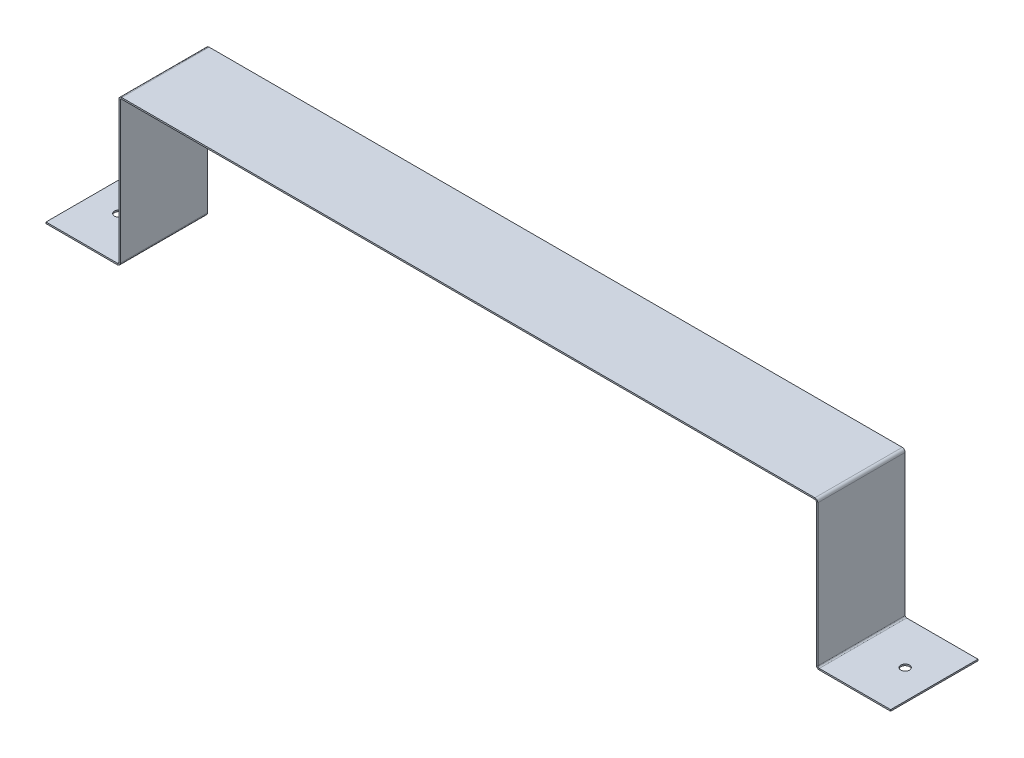
ISO-10303-21;
HEADER;
FILE_DESCRIPTION(('STEP AP214'),'2;1');
FILE_NAME('part.step','',(''),(''),'','','');
FILE_SCHEMA(('AUTOMOTIVE_DESIGN { 1 0 10303 214 1 1 1 1 }'));
ENDSEC;
DATA;
#1=APPLICATION_CONTEXT('core data for automotive mechanical design processes');
#2=APPLICATION_PROTOCOL_DEFINITION('international standard','automotive_design',2000,#1);
#3=PRODUCT_CONTEXT('',#1,'mechanical');
#4=PRODUCT('Part','Part','',(#3));
#5=PRODUCT_RELATED_PRODUCT_CATEGORY('part','',(#4));
#6=PRODUCT_DEFINITION_FORMATION('','',#4);
#7=PRODUCT_DEFINITION_CONTEXT('part definition',#1,'design');
#8=PRODUCT_DEFINITION('design','',#6,#7);
#9=PRODUCT_DEFINITION_SHAPE('','',#8);
#10=(LENGTH_UNIT() NAMED_UNIT(*) SI_UNIT(.MILLI.,.METRE.));
#11=(NAMED_UNIT(*) PLANE_ANGLE_UNIT() SI_UNIT($,.RADIAN.));
#12=(NAMED_UNIT(*) SI_UNIT($,.STERADIAN.) SOLID_ANGLE_UNIT());
#13=UNCERTAINTY_MEASURE_WITH_UNIT(LENGTH_MEASURE(1.E-05),#10,'distance_accuracy_value','');
#14=(GEOMETRIC_REPRESENTATION_CONTEXT(3) GLOBAL_UNCERTAINTY_ASSIGNED_CONTEXT((#13)) GLOBAL_UNIT_ASSIGNED_CONTEXT((#10,
#11,#12)) REPRESENTATION_CONTEXT('',''));
#15=CARTESIAN_POINT('',(0.,0.,0.));
#16=DIRECTION('',(0.,0.,1.));
#17=DIRECTION('',(1.,0.,0.));
#18=AXIS2_PLACEMENT_3D('',#15,#16,#17);
#19=CARTESIAN_POINT('',(-120.,0.5,30.));
#20=DIRECTION('',(0.,0.,1.));
#21=DIRECTION('',(1.,0.,0.));
#22=AXIS2_PLACEMENT_3D('',#19,#20,#21);
#23=PLANE('',#22);
#24=DIRECTION('',(1.,0.,0.));
#25=VECTOR('',#24,1.);
#26=CARTESIAN_POINT('',(-120.,0.5,30.));
#27=LINE('',#26,#25);
#28=CARTESIAN_POINT('',(-120.,0.5,30.));
#29=VERTEX_POINT('',#28);
#30=CARTESIAN_POINT('',(-119.5,0.5,30.));
#31=VERTEX_POINT('',#30);
#32=EDGE_CURVE('E11',#29,#31,#27,.T.);
#33=ORIENTED_EDGE('',*,*,#32,.F.);
#34=CARTESIAN_POINT('',(-120.5,0.5,30.));
#35=DIRECTION('',(0.,0.,-1.));
#36=DIRECTION('',(-1.,0.,0.));
#37=AXIS2_PLACEMENT_3D('',#34,#35,#36);
#38=CIRCLE('',#37,0.5);
#39=CARTESIAN_POINT('',(-120.5,0.,30.));
#40=VERTEX_POINT('',#39);
#41=EDGE_CURVE('E367',#40,#29,#38,.F.);
#42=ORIENTED_EDGE('',*,*,#41,.F.);
#43=DIRECTION('',(0.,1.,0.));
#44=VECTOR('',#43,1.);
#45=CARTESIAN_POINT('',(-120.5,-0.5,30.));
#46=LINE('',#45,#44);
#47=CARTESIAN_POINT('',(-120.5,-0.5,30.));
#48=VERTEX_POINT('',#47);
#49=EDGE_CURVE('E45',#48,#40,#46,.T.);
#50=ORIENTED_EDGE('',*,*,#49,.F.);
#51=CARTESIAN_POINT('',(-120.5,0.5,30.));
#52=DIRECTION('',(0.,0.,1.));
#53=DIRECTION('',(1.,0.,0.));
#54=AXIS2_PLACEMENT_3D('',#51,#52,#53);
#55=CIRCLE('',#54,1.);
#56=EDGE_CURVE('E380',#48,#31,#55,.T.);
#57=ORIENTED_EDGE('',*,*,#56,.T.);
#58=EDGE_LOOP('',(#33,#42,#50,#57));
#59=FACE_BOUND('',#58,.T.);
#60=ADVANCED_FACE('F37',(#59),#23,.T.);
#61=CARTESIAN_POINT('',(-120.5,-0.5,30.));
#62=DIRECTION('',(0.,0.,1.));
#63=DIRECTION('',(1.,0.,0.));
#64=AXIS2_PLACEMENT_3D('',#61,#62,#63);
#65=PLANE('',#64);
#66=DIRECTION('',(0.,1.,0.));
#67=VECTOR('',#66,1.);
#68=CARTESIAN_POINT('',(-120.,0.,30.));
#69=LINE('',#68,#67);
#70=CARTESIAN_POINT('',(-120.,49.,30.));
#71=VERTEX_POINT('',#70);
#72=EDGE_CURVE('E371',#29,#71,#69,.T.);
#73=ORIENTED_EDGE('',*,*,#72,.F.);
#74=ORIENTED_EDGE('',*,*,#32,.T.);
#75=DIRECTION('',(0.,1.,0.));
#76=VECTOR('',#75,1.);
#77=CARTESIAN_POINT('',(-119.5,0.,30.));
#78=LINE('',#77,#76);
#79=CARTESIAN_POINT('',(-119.5,49.,30.));
#80=VERTEX_POINT('',#79);
#81=EDGE_CURVE('E382',#31,#80,#78,.T.);
#82=ORIENTED_EDGE('',*,*,#81,.T.);
#83=DIRECTION('',(-1.,0.,0.));
#84=VECTOR('',#83,1.);
#85=CARTESIAN_POINT('',(-119.5,49.,30.));
#86=LINE('',#85,#84);
#87=EDGE_CURVE('E341',#80,#71,#86,.T.);
#88=ORIENTED_EDGE('',*,*,#87,.T.);
#89=EDGE_LOOP('',(#73,#74,#82,#88));
#90=FACE_BOUND('',#89,.T.);
#91=ADVANCED_FACE('F452',(#90),#65,.T.);
#92=CARTESIAN_POINT('',(-120.5,0.,0.));
#93=DIRECTION('',(0.,0.,-1.));
#94=DIRECTION('',(-1.,0.,0.));
#95=AXIS2_PLACEMENT_3D('',#92,#93,#94);
#96=PLANE('',#95);
#97=DIRECTION('',(0.,-1.,0.));
#98=VECTOR('',#97,1.);
#99=CARTESIAN_POINT('',(-120.5,0.,0.));
#100=LINE('',#99,#98);
#101=CARTESIAN_POINT('',(-120.5,0.,0.));
#102=VERTEX_POINT('',#101);
#103=CARTESIAN_POINT('',(-120.5,-0.5,0.));
#104=VERTEX_POINT('',#103);
#105=EDGE_CURVE('E347',#102,#104,#100,.T.);
#106=ORIENTED_EDGE('',*,*,#105,.F.);
#107=CARTESIAN_POINT('',(-120.5,0.5,0.));
#108=DIRECTION('',(0.,0.,-1.));
#109=DIRECTION('',(-1.,0.,0.));
#110=AXIS2_PLACEMENT_3D('',#107,#108,#109);
#111=CIRCLE('',#110,0.5);
#112=CARTESIAN_POINT('',(-120.,0.5,0.));
#113=VERTEX_POINT('',#112);
#114=EDGE_CURVE('E251',#102,#113,#111,.F.);
#115=ORIENTED_EDGE('',*,*,#114,.T.);
#116=DIRECTION('',(-1.,0.,0.));
#117=VECTOR('',#116,1.);
#118=CARTESIAN_POINT('',(-119.5,0.5,0.));
#119=LINE('',#118,#117);
#120=CARTESIAN_POINT('',(-119.5,0.5,0.));
#121=VERTEX_POINT('',#120);
#122=EDGE_CURVE('E345',#121,#113,#119,.T.);
#123=ORIENTED_EDGE('',*,*,#122,.F.);
#124=CARTESIAN_POINT('',(-120.5,0.5,0.));
#125=DIRECTION('',(0.,0.,1.));
#126=DIRECTION('',(1.,0.,0.));
#127=AXIS2_PLACEMENT_3D('',#124,#125,#126);
#128=CIRCLE('',#127,1.);
#129=EDGE_CURVE('E263',#104,#121,#128,.T.);
#130=ORIENTED_EDGE('',*,*,#129,.F.);
#131=EDGE_LOOP('',(#106,#115,#123,#130));
#132=FACE_BOUND('',#131,.T.);
#133=ADVANCED_FACE('F494',(#132),#96,.T.);
#134=CARTESIAN_POINT('',(-119.5,0.5,0.));
#135=DIRECTION('',(0.,0.,-1.));
#136=DIRECTION('',(-1.,0.,0.));
#137=AXIS2_PLACEMENT_3D('',#134,#135,#136);
#138=PLANE('',#137);
#139=DIRECTION('',(1.,0.,0.));
#140=VECTOR('',#139,1.);
#141=CARTESIAN_POINT('',(-145.,0.,0.));
#142=LINE('',#141,#140);
#143=CARTESIAN_POINT('',(-145.,0.,0.));
#144=VERTEX_POINT('',#143);
#145=EDGE_CURVE('E254',#144,#102,#142,.T.);
#146=ORIENTED_EDGE('',*,*,#145,.T.);
#147=ORIENTED_EDGE('',*,*,#105,.T.);
#148=DIRECTION('',(1.,0.,0.));
#149=VECTOR('',#148,1.);
#150=CARTESIAN_POINT('',(-145.,-0.5,0.));
#151=LINE('',#150,#149);
#152=CARTESIAN_POINT('',(-145.,-0.5,0.));
#153=VERTEX_POINT('',#152);
#154=EDGE_CURVE('E260',#153,#104,#151,.T.);
#155=ORIENTED_EDGE('',*,*,#154,.F.);
#156=DIRECTION('',(0.,1.,0.));
#157=VECTOR('',#156,1.);
#158=CARTESIAN_POINT('',(-145.,-0.5,0.));
#159=LINE('',#158,#157);
#160=EDGE_CURVE('E257',#153,#144,#159,.T.);
#161=ORIENTED_EDGE('',*,*,#160,.T.);
#162=EDGE_LOOP('',(#146,#147,#155,#161));
#163=FACE_BOUND('',#162,.T.);
#164=ADVANCED_FACE('F498',(#163),#138,.T.);
#165=CARTESIAN_POINT('',(-119.,50.,30.));
#166=DIRECTION('',(0.,0.,1.));
#167=DIRECTION('',(1.,0.,0.));
#168=AXIS2_PLACEMENT_3D('',#165,#166,#167);
#169=PLANE('',#168);
#170=DIRECTION('',(0.,-1.,0.));
#171=VECTOR('',#170,1.);
#172=CARTESIAN_POINT('',(-119.,50.,30.));
#173=LINE('',#172,#171);
#174=CARTESIAN_POINT('',(-119.,50.,30.));
#175=VERTEX_POINT('',#174);
#176=CARTESIAN_POINT('',(-119.,49.5,30.));
#177=VERTEX_POINT('',#176);
#178=EDGE_CURVE('E343',#175,#177,#173,.T.);
#179=ORIENTED_EDGE('',*,*,#178,.F.);
#180=CARTESIAN_POINT('',(-119.,49.,30.));
#181=DIRECTION('',(0.,0.,1.));
#182=DIRECTION('',(1.,0.,0.));
#183=AXIS2_PLACEMENT_3D('',#180,#181,#182);
#184=CIRCLE('',#183,1.);
#185=EDGE_CURVE('E442',#71,#175,#184,.F.);
#186=ORIENTED_EDGE('',*,*,#185,.F.);
#187=ORIENTED_EDGE('',*,*,#87,.F.);
#188=CARTESIAN_POINT('',(-119.,49.,30.));
#189=DIRECTION('',(0.,0.,1.));
#190=DIRECTION('',(1.,0.,0.));
#191=AXIS2_PLACEMENT_3D('',#188,#189,#190);
#192=CIRCLE('',#191,0.5);
#193=EDGE_CURVE('E385',#80,#177,#192,.F.);
#194=ORIENTED_EDGE('',*,*,#193,.T.);
#195=EDGE_LOOP('',(#179,#186,#187,#194));
#196=FACE_BOUND('',#195,.T.);
#197=ADVANCED_FACE('F459',(#196),#169,.T.);
#198=CARTESIAN_POINT('',(-119.5,49.,30.));
#199=DIRECTION('',(0.,0.,1.));
#200=DIRECTION('',(1.,0.,0.));
#201=AXIS2_PLACEMENT_3D('',#198,#199,#200);
#202=PLANE('',#201);
#203=DIRECTION('',(1.,0.,0.));
#204=VECTOR('',#203,1.);
#205=CARTESIAN_POINT('',(-120.,50.,30.));
#206=LINE('',#205,#204);
#207=CARTESIAN_POINT('',(119.,50.,30.));
#208=VERTEX_POINT('',#207);
#209=EDGE_CURVE('E439',#175,#208,#206,.T.);
#210=ORIENTED_EDGE('',*,*,#209,.F.);
#211=ORIENTED_EDGE('',*,*,#178,.T.);
#212=DIRECTION('',(1.,0.,0.));
#213=VECTOR('',#212,1.);
#214=CARTESIAN_POINT('',(-120.,49.5,30.));
#215=LINE('',#214,#213);
#216=CARTESIAN_POINT('',(119.,49.5,30.));
#217=VERTEX_POINT('',#216);
#218=EDGE_CURVE('E204',#177,#217,#215,.T.);
#219=ORIENTED_EDGE('',*,*,#218,.T.);
#220=DIRECTION('',(-1.11022302462516E-13,1.,0.));
#221=VECTOR('',#220,1.);
#222=CARTESIAN_POINT('',(119.,49.5,30.));
#223=LINE('',#222,#221);
#224=EDGE_CURVE('E195',#217,#208,#223,.T.);
#225=ORIENTED_EDGE('',*,*,#224,.T.);
#226=EDGE_LOOP('',(#210,#211,#219,#225));
#227=FACE_BOUND('',#226,.T.);
#228=ADVANCED_FACE('F391',(#227),#202,.T.);
#229=CARTESIAN_POINT('',(-120.,49.,0.));
#230=DIRECTION('',(0.,0.,-1.));
#231=DIRECTION('',(-1.,0.,0.));
#232=AXIS2_PLACEMENT_3D('',#229,#230,#231);
#233=PLANE('',#232);
#234=DIRECTION('',(1.,0.,0.));
#235=VECTOR('',#234,1.);
#236=CARTESIAN_POINT('',(-120.,49.,0.));
#237=LINE('',#236,#235);
#238=CARTESIAN_POINT('',(-120.,49.,0.));
#239=VERTEX_POINT('',#238);
#240=CARTESIAN_POINT('',(-119.5,49.,0.));
#241=VERTEX_POINT('',#240);
#242=EDGE_CURVE('E339',#239,#241,#237,.T.);
#243=ORIENTED_EDGE('',*,*,#242,.F.);
#244=CARTESIAN_POINT('',(-119.,49.,0.));
#245=DIRECTION('',(0.,0.,1.));
#246=DIRECTION('',(1.,0.,0.));
#247=AXIS2_PLACEMENT_3D('',#244,#245,#246);
#248=CIRCLE('',#247,1.);
#249=CARTESIAN_POINT('',(-119.,50.,0.));
#250=VERTEX_POINT('',#249);
#251=EDGE_CURVE('E245',#239,#250,#248,.F.);
#252=ORIENTED_EDGE('',*,*,#251,.T.);
#253=DIRECTION('',(0.,1.,0.));
#254=VECTOR('',#253,1.);
#255=CARTESIAN_POINT('',(-119.,49.5,0.));
#256=LINE('',#255,#254);
#257=CARTESIAN_POINT('',(-119.,49.5,0.));
#258=VERTEX_POINT('',#257);
#259=EDGE_CURVE('E194',#258,#250,#256,.T.);
#260=ORIENTED_EDGE('',*,*,#259,.F.);
#261=CARTESIAN_POINT('',(-119.,49.,0.));
#262=DIRECTION('',(0.,0.,1.));
#263=DIRECTION('',(1.,0.,0.));
#264=AXIS2_PLACEMENT_3D('',#261,#262,#263);
#265=CIRCLE('',#264,0.5);
#266=EDGE_CURVE('E269',#241,#258,#265,.F.);
#267=ORIENTED_EDGE('',*,*,#266,.F.);
#268=EDGE_LOOP('',(#243,#252,#260,#267));
#269=FACE_BOUND('',#268,.T.);
#270=ADVANCED_FACE('F468',(#269),#233,.T.);
#271=CARTESIAN_POINT('',(-119.,49.5,0.));
#272=DIRECTION('',(0.,0.,-1.));
#273=DIRECTION('',(-1.,0.,0.));
#274=AXIS2_PLACEMENT_3D('',#271,#272,#273);
#275=PLANE('',#274);
#276=DIRECTION('',(0.,1.,0.));
#277=VECTOR('',#276,1.);
#278=CARTESIAN_POINT('',(-120.,0.,0.));
#279=LINE('',#278,#277);
#280=EDGE_CURVE('E248',#113,#239,#279,.T.);
#281=ORIENTED_EDGE('',*,*,#280,.T.);
#282=ORIENTED_EDGE('',*,*,#242,.T.);
#283=DIRECTION('',(0.,1.,0.));
#284=VECTOR('',#283,1.);
#285=CARTESIAN_POINT('',(-119.5,0.,0.));
#286=LINE('',#285,#284);
#287=EDGE_CURVE('E266',#121,#241,#286,.T.);
#288=ORIENTED_EDGE('',*,*,#287,.F.);
#289=ORIENTED_EDGE('',*,*,#122,.T.);
#290=EDGE_LOOP('',(#281,#282,#288,#289));
#291=FACE_BOUND('',#290,.T.);
#292=ADVANCED_FACE('F472',(#291),#275,.T.);
#293=CARTESIAN_POINT('',(120.,49.,30.));
#294=DIRECTION('',(0.,0.,1.));
#295=DIRECTION('',(1.,0.,0.));
#296=AXIS2_PLACEMENT_3D('',#293,#294,#295);
#297=PLANE('',#296);
#298=DIRECTION('',(-1.,0.,0.));
#299=VECTOR('',#298,1.);
#300=CARTESIAN_POINT('',(120.,49.,30.));
#301=LINE('',#300,#299);
#302=CARTESIAN_POINT('',(120.,49.,30.));
#303=VERTEX_POINT('',#302);
#304=CARTESIAN_POINT('',(119.5,49.,30.));
#305=VERTEX_POINT('',#304);
#306=EDGE_CURVE('E182',#303,#305,#301,.T.);
#307=ORIENTED_EDGE('',*,*,#306,.F.);
#308=CARTESIAN_POINT('',(119.,49.,30.));
#309=DIRECTION('',(0.,0.,1.));
#310=DIRECTION('',(1.,0.,0.));
#311=AXIS2_PLACEMENT_3D('',#308,#309,#310);
#312=CIRCLE('',#311,1.);
#313=EDGE_CURVE('E403',#208,#303,#312,.F.);
#314=ORIENTED_EDGE('',*,*,#313,.F.);
#315=ORIENTED_EDGE('',*,*,#224,.F.);
#316=CARTESIAN_POINT('',(119.,49.,30.));
#317=DIRECTION('',(0.,0.,1.));
#318=DIRECTION('',(1.,0.,0.));
#319=AXIS2_PLACEMENT_3D('',#316,#317,#318);
#320=CIRCLE('',#319,0.5);
#321=EDGE_CURVE('E198',#217,#305,#320,.F.);
#322=ORIENTED_EDGE('',*,*,#321,.T.);
#323=EDGE_LOOP('',(#307,#314,#315,#322));
#324=FACE_BOUND('',#323,.T.);
#325=ADVANCED_FACE('F200',(#324),#297,.T.);
#326=CARTESIAN_POINT('',(119.,49.5,30.));
#327=DIRECTION('',(0.,0.,1.));
#328=DIRECTION('',(1.,0.,0.));
#329=AXIS2_PLACEMENT_3D('',#326,#327,#328);
#330=PLANE('',#329);
#331=DIRECTION('',(0.,-1.,0.));
#332=VECTOR('',#331,1.);
#333=CARTESIAN_POINT('',(120.,50.,30.));
#334=LINE('',#333,#332);
#335=CARTESIAN_POINT('',(120.,0.5,30.));
#336=VERTEX_POINT('',#335);
#337=EDGE_CURVE('E189',#303,#336,#334,.T.);
#338=ORIENTED_EDGE('',*,*,#337,.F.);
#339=ORIENTED_EDGE('',*,*,#306,.T.);
#340=DIRECTION('',(0.,1.,0.));
#341=VECTOR('',#340,1.);
#342=CARTESIAN_POINT('',(119.5,50.,30.));
#343=LINE('',#342,#341);
#344=CARTESIAN_POINT('',(119.5,0.500000000000001,30.));
#345=VERTEX_POINT('',#344);
#346=EDGE_CURVE('E186',#305,#345,#343,.F.);
#347=ORIENTED_EDGE('',*,*,#346,.T.);
#348=DIRECTION('',(1.,0.,0.));
#349=VECTOR('',#348,1.);
#350=CARTESIAN_POINT('',(119.5,0.500000000000001,30.));
#351=LINE('',#350,#349);
#352=EDGE_CURVE('E330',#345,#336,#351,.T.);
#353=ORIENTED_EDGE('',*,*,#352,.T.);
#354=EDGE_LOOP('',(#338,#339,#347,#353));
#355=FACE_BOUND('',#354,.T.);
#356=ADVANCED_FACE('F184',(#355),#330,.T.);
#357=CARTESIAN_POINT('',(119.,50.,0.));
#358=DIRECTION('',(0.,0.,-1.));
#359=DIRECTION('',(-1.,0.,0.));
#360=AXIS2_PLACEMENT_3D('',#357,#358,#359);
#361=PLANE('',#360);
#362=DIRECTION('',(1.11022302462516E-13,-1.,0.));
#363=VECTOR('',#362,1.);
#364=CARTESIAN_POINT('',(119.,50.,0.));
#365=LINE('',#364,#363);
#366=CARTESIAN_POINT('',(119.,50.,0.));
#367=VERTEX_POINT('',#366);
#368=CARTESIAN_POINT('',(119.,49.5,0.));
#369=VERTEX_POINT('',#368);
#370=EDGE_CURVE('E335',#367,#369,#365,.T.);
#371=ORIENTED_EDGE('',*,*,#370,.F.);
#372=CARTESIAN_POINT('',(119.,49.,0.));
#373=DIRECTION('',(0.,0.,1.));
#374=DIRECTION('',(1.,0.,0.));
#375=AXIS2_PLACEMENT_3D('',#372,#373,#374);
#376=CIRCLE('',#375,1.);
#377=CARTESIAN_POINT('',(120.,49.,0.));
#378=VERTEX_POINT('',#377);
#379=EDGE_CURVE('E239',#367,#378,#376,.F.);
#380=ORIENTED_EDGE('',*,*,#379,.T.);
#381=DIRECTION('',(1.,0.,0.));
#382=VECTOR('',#381,1.);
#383=CARTESIAN_POINT('',(119.5,49.,0.));
#384=LINE('',#383,#382);
#385=CARTESIAN_POINT('',(119.5,49.,0.));
#386=VERTEX_POINT('',#385);
#387=EDGE_CURVE('E333',#386,#378,#384,.T.);
#388=ORIENTED_EDGE('',*,*,#387,.F.);
#389=CARTESIAN_POINT('',(119.,49.,0.));
#390=DIRECTION('',(0.,0.,1.));
#391=DIRECTION('',(1.,0.,0.));
#392=AXIS2_PLACEMENT_3D('',#389,#390,#391);
#393=CIRCLE('',#392,0.5);
#394=EDGE_CURVE('E211',#369,#386,#393,.F.);
#395=ORIENTED_EDGE('',*,*,#394,.F.);
#396=EDGE_LOOP('',(#371,#380,#388,#395));
#397=FACE_BOUND('',#396,.T.);
#398=ADVANCED_FACE('F397',(#397),#361,.T.);
#399=CARTESIAN_POINT('',(119.5,49.,0.));
#400=DIRECTION('',(0.,0.,-1.));
#401=DIRECTION('',(-1.,0.,0.));
#402=AXIS2_PLACEMENT_3D('',#399,#400,#401);
#403=PLANE('',#402);
#404=DIRECTION('',(1.,0.,0.));
#405=VECTOR('',#404,1.);
#406=CARTESIAN_POINT('',(-120.,50.,0.));
#407=LINE('',#406,#405);
#408=EDGE_CURVE('E242',#250,#367,#407,.T.);
#409=ORIENTED_EDGE('',*,*,#408,.T.);
#410=ORIENTED_EDGE('',*,*,#370,.T.);
#411=DIRECTION('',(1.,0.,0.));
#412=VECTOR('',#411,1.);
#413=CARTESIAN_POINT('',(-120.,49.5,0.));
#414=LINE('',#413,#412);
#415=EDGE_CURVE('E272',#258,#369,#414,.T.);
#416=ORIENTED_EDGE('',*,*,#415,.F.);
#417=ORIENTED_EDGE('',*,*,#259,.T.);
#418=EDGE_LOOP('',(#409,#410,#416,#417));
#419=FACE_BOUND('',#418,.T.);
#420=ADVANCED_FACE('F478',(#419),#403,.T.);
#421=CARTESIAN_POINT('',(120.5,0.,30.));
#422=DIRECTION('',(0.,0.,1.));
#423=DIRECTION('',(1.,0.,0.));
#424=AXIS2_PLACEMENT_3D('',#421,#422,#423);
#425=PLANE('',#424);
#426=DIRECTION('',(0.,-1.,0.));
#427=VECTOR('',#426,1.);
#428=CARTESIAN_POINT('',(120.5,0.,30.));
#429=LINE('',#428,#427);
#430=CARTESIAN_POINT('',(120.5,0.,30.));
#431=VERTEX_POINT('',#430);
#432=CARTESIAN_POINT('',(120.5,-0.5,30.));
#433=VERTEX_POINT('',#432);
#434=EDGE_CURVE('E53',#431,#433,#429,.T.);
#435=ORIENTED_EDGE('',*,*,#434,.F.);
#436=CARTESIAN_POINT('',(120.5,0.5,30.));
#437=DIRECTION('',(0.,0.,-1.));
#438=DIRECTION('',(-1.,0.,0.));
#439=AXIS2_PLACEMENT_3D('',#436,#437,#438);
#440=CIRCLE('',#439,0.5);
#441=EDGE_CURVE('E431',#336,#431,#440,.F.);
#442=ORIENTED_EDGE('',*,*,#441,.F.);
#443=ORIENTED_EDGE('',*,*,#352,.F.);
#444=CARTESIAN_POINT('',(120.5,0.5,30.));
#445=DIRECTION('',(0.,0.,1.));
#446=DIRECTION('',(1.,0.,0.));
#447=AXIS2_PLACEMENT_3D('',#444,#445,#446);
#448=CIRCLE('',#447,1.);
#449=EDGE_CURVE('E219',#345,#433,#448,.T.);
#450=ORIENTED_EDGE('',*,*,#449,.T.);
#451=EDGE_LOOP('',(#435,#442,#443,#450));
#452=FACE_BOUND('',#451,.T.);
#453=ADVANCED_FACE('F480',(#452),#425,.T.);
#454=CARTESIAN_POINT('',(119.5,0.500000000000001,30.));
#455=DIRECTION('',(0.,0.,1.));
#456=DIRECTION('',(1.,0.,0.));
#457=AXIS2_PLACEMENT_3D('',#454,#455,#456);
#458=PLANE('',#457);
#459=DIRECTION('',(1.,0.,0.));
#460=VECTOR('',#459,1.);
#461=CARTESIAN_POINT('',(120.,0.,30.));
#462=LINE('',#461,#460);
#463=CARTESIAN_POINT('',(145.,0.,30.));
#464=VERTEX_POINT('',#463);
#465=EDGE_CURVE('E429',#431,#464,#462,.T.);
#466=ORIENTED_EDGE('',*,*,#465,.F.);
#467=ORIENTED_EDGE('',*,*,#434,.T.);
#468=DIRECTION('',(1.,0.,0.));
#469=VECTOR('',#468,1.);
#470=CARTESIAN_POINT('',(120.,-0.5,30.));
#471=LINE('',#470,#469);
#472=CARTESIAN_POINT('',(145.,-0.5,30.));
#473=VERTEX_POINT('',#472);
#474=EDGE_CURVE('E131',#433,#473,#471,.T.);
#475=ORIENTED_EDGE('',*,*,#474,.T.);
#476=DIRECTION('',(0.,-1.,0.));
#477=VECTOR('',#476,1.);
#478=CARTESIAN_POINT('',(145.,0.,30.));
#479=LINE('',#478,#477);
#480=EDGE_CURVE('E427',#464,#473,#479,.T.);
#481=ORIENTED_EDGE('',*,*,#480,.F.);
#482=EDGE_LOOP('',(#466,#467,#475,#481));
#483=FACE_BOUND('',#482,.T.);
#484=ADVANCED_FACE('F486',(#483),#458,.T.);
#485=CARTESIAN_POINT('',(120.,0.5,0.));
#486=DIRECTION('',(0.,0.,-1.));
#487=DIRECTION('',(-1.,0.,0.));
#488=AXIS2_PLACEMENT_3D('',#485,#486,#487);
#489=PLANE('',#488);
#490=DIRECTION('',(-1.,0.,0.));
#491=VECTOR('',#490,1.);
#492=CARTESIAN_POINT('',(120.,0.5,0.));
#493=LINE('',#492,#491);
#494=CARTESIAN_POINT('',(120.,0.5,0.));
#495=VERTEX_POINT('',#494);
#496=CARTESIAN_POINT('',(119.5,0.500000000000001,0.));
#497=VERTEX_POINT('',#496);
#498=EDGE_CURVE('E118',#495,#497,#493,.T.);
#499=ORIENTED_EDGE('',*,*,#498,.F.);
#500=CARTESIAN_POINT('',(120.5,0.5,0.));
#501=DIRECTION('',(0.,0.,-1.));
#502=DIRECTION('',(-1.,0.,0.));
#503=AXIS2_PLACEMENT_3D('',#500,#501,#502);
#504=CIRCLE('',#503,0.5);
#505=CARTESIAN_POINT('',(120.5,0.,0.));
#506=VERTEX_POINT('',#505);
#507=EDGE_CURVE('E235',#495,#506,#504,.F.);
#508=ORIENTED_EDGE('',*,*,#507,.T.);
#509=DIRECTION('',(0.,1.,0.));
#510=VECTOR('',#509,1.);
#511=CARTESIAN_POINT('',(120.5,-0.5,0.));
#512=LINE('',#511,#510);
#513=CARTESIAN_POINT('',(120.5,-0.5,0.));
#514=VERTEX_POINT('',#513);
#515=EDGE_CURVE('E125',#514,#506,#512,.T.);
#516=ORIENTED_EDGE('',*,*,#515,.F.);
#517=CARTESIAN_POINT('',(120.5,0.5,0.));
#518=DIRECTION('',(0.,0.,1.));
#519=DIRECTION('',(1.,0.,0.));
#520=AXIS2_PLACEMENT_3D('',#517,#518,#519);
#521=CIRCLE('',#520,1.);
#522=EDGE_CURVE('E278',#497,#514,#521,.T.);
#523=ORIENTED_EDGE('',*,*,#522,.F.);
#524=EDGE_LOOP('',(#499,#508,#516,#523));
#525=FACE_BOUND('',#524,.T.);
#526=ADVANCED_FACE('F414',(#525),#489,.T.);
#527=CARTESIAN_POINT('',(120.5,-0.5,0.));
#528=DIRECTION('',(0.,0.,-1.));
#529=DIRECTION('',(-1.,0.,0.));
#530=AXIS2_PLACEMENT_3D('',#527,#528,#529);
#531=PLANE('',#530);
#532=DIRECTION('',(0.,-1.,0.));
#533=VECTOR('',#532,1.);
#534=CARTESIAN_POINT('',(120.,50.,0.));
#535=LINE('',#534,#533);
#536=EDGE_CURVE('E237',#378,#495,#535,.T.);
#537=ORIENTED_EDGE('',*,*,#536,.T.);
#538=ORIENTED_EDGE('',*,*,#498,.T.);
#539=DIRECTION('',(0.,1.,0.));
#540=VECTOR('',#539,1.);
#541=CARTESIAN_POINT('',(119.5,50.,0.));
#542=LINE('',#541,#540);
#543=EDGE_CURVE('E276',#386,#497,#542,.F.);
#544=ORIENTED_EDGE('',*,*,#543,.F.);
#545=ORIENTED_EDGE('',*,*,#387,.T.);
#546=EDGE_LOOP('',(#537,#538,#544,#545));
#547=FACE_BOUND('',#546,.T.);
#548=ADVANCED_FACE('F399',(#547),#531,.T.);
#549=CARTESIAN_POINT('',(120.,-0.5,30.));
#550=DIRECTION('',(0.,1.,0.));
#551=DIRECTION('',(0.,0.,1.));
#552=AXIS2_PLACEMENT_3D('',#549,#550,#551);
#553=PLANE('',#552);
#554=CARTESIAN_POINT('',(135.,-0.5,15.));
#555=DIRECTION('',(0.,1.,0.));
#556=DIRECTION('',(0.,0.,1.));
#557=AXIS2_PLACEMENT_3D('',#554,#555,#556);
#558=CIRCLE('',#557,1.5);
#559=CARTESIAN_POINT('',(135.,-0.5,16.5));
#560=VERTEX_POINT('',#559);
#561=EDGE_CURVE('E229',#560,#560,#558,.T.);
#562=ORIENTED_EDGE('',*,*,#561,.T.);
#563=EDGE_LOOP('',(#562));
#564=FACE_BOUND('',#563,.T.);
#565=DIRECTION('',(1.,0.,0.));
#566=VECTOR('',#565,1.);
#567=CARTESIAN_POINT('',(120.,-0.5,0.));
#568=LINE('',#567,#566);
#569=CARTESIAN_POINT('',(145.,-0.5,0.));
#570=VERTEX_POINT('',#569);
#571=EDGE_CURVE('E225',#514,#570,#568,.T.);
#572=ORIENTED_EDGE('',*,*,#571,.T.);
#573=DIRECTION('',(0.,0.,-1.));
#574=VECTOR('',#573,1.);
#575=CARTESIAN_POINT('',(145.,-0.5,30.));
#576=LINE('',#575,#574);
#577=EDGE_CURVE('E326',#473,#570,#576,.T.);
#578=ORIENTED_EDGE('',*,*,#577,.F.);
#579=ORIENTED_EDGE('',*,*,#474,.F.);
#580=DIRECTION('',(0.,0.,-1.));
#581=VECTOR('',#580,1.);
#582=CARTESIAN_POINT('',(120.5,-0.5,30.));
#583=LINE('',#582,#581);
#584=EDGE_CURVE('E221',#433,#514,#583,.T.);
#585=ORIENTED_EDGE('',*,*,#584,.T.);
#586=EDGE_LOOP('',(#572,#578,#579,#585));
#587=FACE_BOUND('',#586,.T.);
#588=ADVANCED_FACE('F420',(#564,#587),#553,.F.);
#589=CARTESIAN_POINT('',(145.,0.,30.));
#590=DIRECTION('',(1.,0.,0.));
#591=DIRECTION('',(0.,0.,-1.));
#592=AXIS2_PLACEMENT_3D('',#589,#590,#591);
#593=PLANE('',#592);
#594=DIRECTION('',(0.,-1.,0.));
#595=VECTOR('',#594,1.);
#596=CARTESIAN_POINT('',(145.,0.,0.));
#597=LINE('',#596,#595);
#598=CARTESIAN_POINT('',(145.,0.,0.));
#599=VERTEX_POINT('',#598);
#600=EDGE_CURVE('E228',#599,#570,#597,.T.);
#601=ORIENTED_EDGE('',*,*,#600,.F.);
#602=DIRECTION('',(0.,0.,-1.));
#603=VECTOR('',#602,1.);
#604=CARTESIAN_POINT('',(145.,0.,30.));
#605=LINE('',#604,#603);
#606=EDGE_CURVE('E324',#464,#599,#605,.T.);
#607=ORIENTED_EDGE('',*,*,#606,.F.);
#608=ORIENTED_EDGE('',*,*,#480,.T.);
#609=ORIENTED_EDGE('',*,*,#577,.T.);
#610=EDGE_LOOP('',(#601,#607,#608,#609));
#611=FACE_BOUND('',#610,.T.);
#612=ADVANCED_FACE('F425',(#611),#593,.T.);
#613=CARTESIAN_POINT('',(120.,0.,30.));
#614=DIRECTION('',(0.,1.,0.));
#615=DIRECTION('',(0.,0.,1.));
#616=AXIS2_PLACEMENT_3D('',#613,#614,#615);
#617=PLANE('',#616);
#618=CARTESIAN_POINT('',(135.,0.,15.));
#619=DIRECTION('',(0.,1.,0.));
#620=DIRECTION('',(0.,0.,1.));
#621=AXIS2_PLACEMENT_3D('',#618,#619,#620);
#622=CIRCLE('',#621,1.5);
#623=CARTESIAN_POINT('',(135.,0.,16.5));
#624=VERTEX_POINT('',#623);
#625=EDGE_CURVE('E903',#624,#624,#622,.T.);
#626=ORIENTED_EDGE('',*,*,#625,.F.);
#627=EDGE_LOOP('',(#626));
#628=FACE_BOUND('',#627,.T.);
#629=DIRECTION('',(1.,0.,0.));
#630=VECTOR('',#629,1.);
#631=CARTESIAN_POINT('',(120.,0.,0.));
#632=LINE('',#631,#630);
#633=EDGE_CURVE('E232',#506,#599,#632,.T.);
#634=ORIENTED_EDGE('',*,*,#633,.F.);
#635=DIRECTION('',(0.,0.,-1.));
#636=VECTOR('',#635,1.);
#637=CARTESIAN_POINT('',(120.5,0.,30.));
#638=LINE('',#637,#636);
#639=EDGE_CURVE('E321',#431,#506,#638,.T.);
#640=ORIENTED_EDGE('',*,*,#639,.F.);
#641=ORIENTED_EDGE('',*,*,#465,.T.);
#642=ORIENTED_EDGE('',*,*,#606,.T.);
#643=EDGE_LOOP('',(#634,#640,#641,#642));
#644=FACE_BOUND('',#643,.T.);
#645=ADVANCED_FACE('F575',(#628,#644),#617,.T.);
#646=CARTESIAN_POINT('',(120.5,0.5,30.));
#647=DIRECTION('',(0.,0.,-1.));
#648=DIRECTION('',(-1.,0.,0.));
#649=AXIS2_PLACEMENT_3D('',#646,#647,#648);
#650=CYLINDRICAL_SURFACE('',#649,0.5);
#651=ORIENTED_EDGE('',*,*,#507,.F.);
#652=DIRECTION('',(0.,0.,-1.));
#653=VECTOR('',#652,1.);
#654=CARTESIAN_POINT('',(120.,0.5,30.));
#655=LINE('',#654,#653);
#656=EDGE_CURVE('E318',#336,#495,#655,.T.);
#657=ORIENTED_EDGE('',*,*,#656,.F.);
#658=ORIENTED_EDGE('',*,*,#441,.T.);
#659=ORIENTED_EDGE('',*,*,#639,.T.);
#660=EDGE_LOOP('',(#651,#657,#658,#659));
#661=FACE_BOUND('',#660,.T.);
#662=ADVANCED_FACE('F411',(#661),#650,.F.);
#663=CARTESIAN_POINT('',(120.,50.,30.));
#664=DIRECTION('',(1.,0.,0.));
#665=DIRECTION('',(0.,0.,-1.));
#666=AXIS2_PLACEMENT_3D('',#663,#664,#665);
#667=PLANE('',#666);
#668=ORIENTED_EDGE('',*,*,#536,.F.);
#669=DIRECTION('',(0.,0.,-1.));
#670=VECTOR('',#669,1.);
#671=CARTESIAN_POINT('',(120.,49.,30.));
#672=LINE('',#671,#670);
#673=EDGE_CURVE('E315',#303,#378,#672,.T.);
#674=ORIENTED_EDGE('',*,*,#673,.F.);
#675=ORIENTED_EDGE('',*,*,#337,.T.);
#676=ORIENTED_EDGE('',*,*,#656,.T.);
#677=EDGE_LOOP('',(#668,#674,#675,#676));
#678=FACE_BOUND('',#677,.T.);
#679=ADVANCED_FACE('F405',(#678),#667,.T.);
#680=CARTESIAN_POINT('',(119.,49.,30.));
#681=DIRECTION('',(0.,0.,-1.));
#682=DIRECTION('',(-1.,0.,0.));
#683=AXIS2_PLACEMENT_3D('',#680,#681,#682);
#684=CYLINDRICAL_SURFACE('',#683,1.);
#685=ORIENTED_EDGE('',*,*,#379,.F.);
#686=DIRECTION('',(0.,0.,-1.));
#687=VECTOR('',#686,1.);
#688=CARTESIAN_POINT('',(119.,50.,30.));
#689=LINE('',#688,#687);
#690=EDGE_CURVE('E312',#208,#367,#689,.T.);
#691=ORIENTED_EDGE('',*,*,#690,.F.);
#692=ORIENTED_EDGE('',*,*,#313,.T.);
#693=ORIENTED_EDGE('',*,*,#673,.T.);
#694=EDGE_LOOP('',(#685,#691,#692,#693));
#695=FACE_BOUND('',#694,.T.);
#696=ADVANCED_FACE('F402',(#695),#684,.T.);
#697=CARTESIAN_POINT('',(-120.,50.,30.));
#698=DIRECTION('',(0.,1.,0.));
#699=DIRECTION('',(0.,0.,1.));
#700=AXIS2_PLACEMENT_3D('',#697,#698,#699);
#701=PLANE('',#700);
#702=ORIENTED_EDGE('',*,*,#408,.F.);
#703=DIRECTION('',(0.,0.,-1.));
#704=VECTOR('',#703,1.);
#705=CARTESIAN_POINT('',(-119.,50.,30.));
#706=LINE('',#705,#704);
#707=EDGE_CURVE('E309',#175,#250,#706,.T.);
#708=ORIENTED_EDGE('',*,*,#707,.F.);
#709=ORIENTED_EDGE('',*,*,#209,.T.);
#710=ORIENTED_EDGE('',*,*,#690,.T.);
#711=EDGE_LOOP('',(#702,#708,#709,#710));
#712=FACE_BOUND('',#711,.T.);
#713=ADVANCED_FACE('F465',(#712),#701,.T.);
#714=CARTESIAN_POINT('',(-119.,49.,30.));
#715=DIRECTION('',(0.,0.,-1.));
#716=DIRECTION('',(-1.,0.,0.));
#717=AXIS2_PLACEMENT_3D('',#714,#715,#716);
#718=CYLINDRICAL_SURFACE('',#717,1.);
#719=ORIENTED_EDGE('',*,*,#251,.F.);
#720=DIRECTION('',(0.,0.,-1.));
#721=VECTOR('',#720,1.);
#722=CARTESIAN_POINT('',(-120.,49.,30.));
#723=LINE('',#722,#721);
#724=EDGE_CURVE('E306',#71,#239,#723,.T.);
#725=ORIENTED_EDGE('',*,*,#724,.F.);
#726=ORIENTED_EDGE('',*,*,#185,.T.);
#727=ORIENTED_EDGE('',*,*,#707,.T.);
#728=EDGE_LOOP('',(#719,#725,#726,#727));
#729=FACE_BOUND('',#728,.T.);
#730=ADVANCED_FACE('F458',(#729),#718,.T.);
#731=CARTESIAN_POINT('',(-120.,0.,30.));
#732=DIRECTION('',(-1.,0.,0.));
#733=DIRECTION('',(0.,0.,1.));
#734=AXIS2_PLACEMENT_3D('',#731,#732,#733);
#735=PLANE('',#734);
#736=ORIENTED_EDGE('',*,*,#280,.F.);
#737=DIRECTION('',(0.,0.,-1.));
#738=VECTOR('',#737,1.);
#739=CARTESIAN_POINT('',(-120.,0.5,30.));
#740=LINE('',#739,#738);
#741=EDGE_CURVE('E303',#29,#113,#740,.T.);
#742=ORIENTED_EDGE('',*,*,#741,.F.);
#743=ORIENTED_EDGE('',*,*,#72,.T.);
#744=ORIENTED_EDGE('',*,*,#724,.T.);
#745=EDGE_LOOP('',(#736,#742,#743,#744));
#746=FACE_BOUND('',#745,.T.);
#747=ADVANCED_FACE('F448',(#746),#735,.T.);
#748=CARTESIAN_POINT('',(-120.5,0.5,30.));
#749=DIRECTION('',(0.,0.,-1.));
#750=DIRECTION('',(-1.,0.,0.));
#751=AXIS2_PLACEMENT_3D('',#748,#749,#750);
#752=CYLINDRICAL_SURFACE('',#751,0.5);
#753=ORIENTED_EDGE('',*,*,#114,.F.);
#754=DIRECTION('',(0.,0.,-1.));
#755=VECTOR('',#754,1.);
#756=CARTESIAN_POINT('',(-120.5,0.,30.));
#757=LINE('',#756,#755);
#758=EDGE_CURVE('E300',#40,#102,#757,.T.);
#759=ORIENTED_EDGE('',*,*,#758,.F.);
#760=ORIENTED_EDGE('',*,*,#41,.T.);
#761=ORIENTED_EDGE('',*,*,#741,.T.);
#762=EDGE_LOOP('',(#753,#759,#760,#761));
#763=FACE_BOUND('',#762,.T.);
#764=ADVANCED_FACE('F366',(#763),#752,.F.);
#765=CARTESIAN_POINT('',(-145.,0.,30.));
#766=DIRECTION('',(0.,1.,0.));
#767=DIRECTION('',(0.,0.,1.));
#768=AXIS2_PLACEMENT_3D('',#765,#766,#767);
#769=PLANE('',#768);
#770=CARTESIAN_POINT('',(-135.,0.,15.0000000000009));
#771=DIRECTION('',(0.,1.,0.));
#772=DIRECTION('',(0.,0.,-1.));
#773=AXIS2_PLACEMENT_3D('',#770,#771,#772);
#774=CIRCLE('',#773,1.5);
#775=CARTESIAN_POINT('',(-135.,0.,13.5000000000009));
#776=VERTEX_POINT('',#775);
#777=EDGE_CURVE('E908',#776,#776,#774,.T.);
#778=ORIENTED_EDGE('',*,*,#777,.F.);
#779=EDGE_LOOP('',(#778));
#780=FACE_BOUND('',#779,.T.);
#781=ORIENTED_EDGE('',*,*,#145,.F.);
#782=DIRECTION('',(0.,0.,-1.));
#783=VECTOR('',#782,1.);
#784=CARTESIAN_POINT('',(-145.,0.,30.));
#785=LINE('',#784,#783);
#786=CARTESIAN_POINT('',(-145.,0.,30.));
#787=VERTEX_POINT('',#786);
#788=EDGE_CURVE('E298',#787,#144,#785,.T.);
#789=ORIENTED_EDGE('',*,*,#788,.F.);
#790=DIRECTION('',(1.,0.,0.));
#791=VECTOR('',#790,1.);
#792=CARTESIAN_POINT('',(-145.,0.,30.));
#793=LINE('',#792,#791);
#794=EDGE_CURVE('E355',#787,#40,#793,.T.);
#795=ORIENTED_EDGE('',*,*,#794,.T.);
#796=ORIENTED_EDGE('',*,*,#758,.T.);
#797=EDGE_LOOP('',(#781,#789,#795,#796));
#798=FACE_BOUND('',#797,.T.);
#799=ADVANCED_FACE('F373',(#780,#798),#769,.T.);
#800=CARTESIAN_POINT('',(-145.,-0.5,30.));
#801=DIRECTION('',(-1.,0.,0.));
#802=DIRECTION('',(0.,0.,1.));
#803=AXIS2_PLACEMENT_3D('',#800,#801,#802);
#804=PLANE('',#803);
#805=ORIENTED_EDGE('',*,*,#160,.F.);
#806=DIRECTION('',(0.,0.,-1.));
#807=VECTOR('',#806,1.);
#808=CARTESIAN_POINT('',(-145.,-0.5,30.));
#809=LINE('',#808,#807);
#810=CARTESIAN_POINT('',(-145.,-0.5,30.));
#811=VERTEX_POINT('',#810);
#812=EDGE_CURVE('E296',#811,#153,#809,.T.);
#813=ORIENTED_EDGE('',*,*,#812,.F.);
#814=DIRECTION('',(0.,1.,0.));
#815=VECTOR('',#814,1.);
#816=CARTESIAN_POINT('',(-145.,-0.5,30.));
#817=LINE('',#816,#815);
#818=EDGE_CURVE('E374',#811,#787,#817,.T.);
#819=ORIENTED_EDGE('',*,*,#818,.T.);
#820=ORIENTED_EDGE('',*,*,#788,.T.);
#821=EDGE_LOOP('',(#805,#813,#819,#820));
#822=FACE_BOUND('',#821,.T.);
#823=ADVANCED_FACE('F648',(#822),#804,.T.);
#824=CARTESIAN_POINT('',(-145.,-0.5,30.));
#825=DIRECTION('',(0.,1.,0.));
#826=DIRECTION('',(0.,0.,1.));
#827=AXIS2_PLACEMENT_3D('',#824,#825,#826);
#828=PLANE('',#827);
#829=CARTESIAN_POINT('',(-135.,-0.5,15.0000000000009));
#830=DIRECTION('',(0.,1.,0.));
#831=DIRECTION('',(0.,0.,-1.));
#832=AXIS2_PLACEMENT_3D('',#829,#830,#831);
#833=CIRCLE('',#832,1.5);
#834=CARTESIAN_POINT('',(-135.,-0.5,13.5000000000009));
#835=VERTEX_POINT('',#834);
#836=EDGE_CURVE('E904',#835,#835,#833,.T.);
#837=ORIENTED_EDGE('',*,*,#836,.T.);
#838=EDGE_LOOP('',(#837));
#839=FACE_BOUND('',#838,.T.);
#840=ORIENTED_EDGE('',*,*,#154,.T.);
#841=DIRECTION('',(0.,0.,-1.));
#842=VECTOR('',#841,1.);
#843=CARTESIAN_POINT('',(-120.5,-0.5,30.));
#844=LINE('',#843,#842);
#845=EDGE_CURVE('E293',#48,#104,#844,.T.);
#846=ORIENTED_EDGE('',*,*,#845,.F.);
#847=DIRECTION('',(1.,0.,0.));
#848=VECTOR('',#847,1.);
#849=CARTESIAN_POINT('',(-145.,-0.5,30.));
#850=LINE('',#849,#848);
#851=EDGE_CURVE('E358',#811,#48,#850,.T.);
#852=ORIENTED_EDGE('',*,*,#851,.F.);
#853=ORIENTED_EDGE('',*,*,#812,.T.);
#854=EDGE_LOOP('',(#840,#846,#852,#853));
#855=FACE_BOUND('',#854,.T.);
#856=ADVANCED_FACE('F653',(#839,#855),#828,.F.);
#857=CARTESIAN_POINT('',(-120.5,0.5,30.));
#858=DIRECTION('',(0.,0.,-1.));
#859=DIRECTION('',(-1.,0.,0.));
#860=AXIS2_PLACEMENT_3D('',#857,#858,#859);
#861=CYLINDRICAL_SURFACE('',#860,1.);
#862=ORIENTED_EDGE('',*,*,#129,.T.);
#863=DIRECTION('',(0.,0.,-1.));
#864=VECTOR('',#863,1.);
#865=CARTESIAN_POINT('',(-119.5,0.5,30.));
#866=LINE('',#865,#864);
#867=EDGE_CURVE('E290',#31,#121,#866,.T.);
#868=ORIENTED_EDGE('',*,*,#867,.F.);
#869=ORIENTED_EDGE('',*,*,#56,.F.);
#870=ORIENTED_EDGE('',*,*,#845,.T.);
#871=EDGE_LOOP('',(#862,#868,#869,#870));
#872=FACE_BOUND('',#871,.T.);
#873=ADVANCED_FACE('F662',(#872),#861,.T.);
#874=CARTESIAN_POINT('',(-119.5,0.,30.));
#875=DIRECTION('',(-1.,0.,0.));
#876=DIRECTION('',(0.,0.,1.));
#877=AXIS2_PLACEMENT_3D('',#874,#875,#876);
#878=PLANE('',#877);
#879=ORIENTED_EDGE('',*,*,#287,.T.);
#880=DIRECTION('',(0.,0.,-1.));
#881=VECTOR('',#880,1.);
#882=CARTESIAN_POINT('',(-119.5,49.,30.));
#883=LINE('',#882,#881);
#884=EDGE_CURVE('E287',#80,#241,#883,.T.);
#885=ORIENTED_EDGE('',*,*,#884,.F.);
#886=ORIENTED_EDGE('',*,*,#81,.F.);
#887=ORIENTED_EDGE('',*,*,#867,.T.);
#888=EDGE_LOOP('',(#879,#885,#886,#887));
#889=FACE_BOUND('',#888,.T.);
#890=ADVANCED_FACE('F474',(#889),#878,.F.);
#891=CARTESIAN_POINT('',(-119.,49.,30.));
#892=DIRECTION('',(0.,0.,-1.));
#893=DIRECTION('',(-1.,0.,0.));
#894=AXIS2_PLACEMENT_3D('',#891,#892,#893);
#895=CYLINDRICAL_SURFACE('',#894,0.5);
#896=ORIENTED_EDGE('',*,*,#266,.T.);
#897=DIRECTION('',(0.,0.,-1.));
#898=VECTOR('',#897,1.);
#899=CARTESIAN_POINT('',(-119.,49.5,30.));
#900=LINE('',#899,#898);
#901=EDGE_CURVE('E284',#177,#258,#900,.T.);
#902=ORIENTED_EDGE('',*,*,#901,.F.);
#903=ORIENTED_EDGE('',*,*,#193,.F.);
#904=ORIENTED_EDGE('',*,*,#884,.T.);
#905=EDGE_LOOP('',(#896,#902,#903,#904));
#906=FACE_BOUND('',#905,.T.);
#907=ADVANCED_FACE('F477',(#906),#895,.F.);
#908=CARTESIAN_POINT('',(-120.,49.5,30.));
#909=DIRECTION('',(0.,1.,0.));
#910=DIRECTION('',(0.,0.,1.));
#911=AXIS2_PLACEMENT_3D('',#908,#909,#910);
#912=PLANE('',#911);
#913=ORIENTED_EDGE('',*,*,#415,.T.);
#914=DIRECTION('',(0.,0.,-1.));
#915=VECTOR('',#914,1.);
#916=CARTESIAN_POINT('',(119.,49.5,30.));
#917=LINE('',#916,#915);
#918=EDGE_CURVE('E213',#217,#369,#917,.T.);
#919=ORIENTED_EDGE('',*,*,#918,.F.);
#920=ORIENTED_EDGE('',*,*,#218,.F.);
#921=ORIENTED_EDGE('',*,*,#901,.T.);
#922=EDGE_LOOP('',(#913,#919,#920,#921));
#923=FACE_BOUND('',#922,.T.);
#924=ADVANCED_FACE('F394',(#923),#912,.F.);
#925=CARTESIAN_POINT('',(119.,49.,30.));
#926=DIRECTION('',(0.,0.,-1.));
#927=DIRECTION('',(-1.,0.,0.));
#928=AXIS2_PLACEMENT_3D('',#925,#926,#927);
#929=CYLINDRICAL_SURFACE('',#928,0.5);
#930=ORIENTED_EDGE('',*,*,#394,.T.);
#931=DIRECTION('',(0.,0.,-1.));
#932=VECTOR('',#931,1.);
#933=CARTESIAN_POINT('',(119.5,49.,30.));
#934=LINE('',#933,#932);
#935=EDGE_CURVE('E208',#305,#386,#934,.T.);
#936=ORIENTED_EDGE('',*,*,#935,.F.);
#937=ORIENTED_EDGE('',*,*,#321,.F.);
#938=ORIENTED_EDGE('',*,*,#918,.T.);
#939=EDGE_LOOP('',(#930,#936,#937,#938));
#940=FACE_BOUND('',#939,.T.);
#941=ADVANCED_FACE('F209',(#940),#929,.F.);
#942=CARTESIAN_POINT('',(119.5,50.,30.));
#943=DIRECTION('',(1.,0.,0.));
#944=DIRECTION('',(0.,0.,-1.));
#945=AXIS2_PLACEMENT_3D('',#942,#943,#944);
#946=PLANE('',#945);
#947=ORIENTED_EDGE('',*,*,#543,.T.);
#948=DIRECTION('',(0.,0.,-1.));
#949=VECTOR('',#948,1.);
#950=CARTESIAN_POINT('',(119.5,0.500000000000001,30.));
#951=LINE('',#950,#949);
#952=EDGE_CURVE('E214',#345,#497,#951,.T.);
#953=ORIENTED_EDGE('',*,*,#952,.F.);
#954=ORIENTED_EDGE('',*,*,#346,.F.);
#955=ORIENTED_EDGE('',*,*,#935,.T.);
#956=EDGE_LOOP('',(#947,#953,#954,#955));
#957=FACE_BOUND('',#956,.T.);
#958=ADVANCED_FACE('F216',(#957),#946,.F.);
#959=CARTESIAN_POINT('',(120.5,0.5,30.));
#960=DIRECTION('',(0.,0.,-1.));
#961=DIRECTION('',(-1.,0.,0.));
#962=AXIS2_PLACEMENT_3D('',#959,#960,#961);
#963=CYLINDRICAL_SURFACE('',#962,1.);
#964=ORIENTED_EDGE('',*,*,#522,.T.);
#965=ORIENTED_EDGE('',*,*,#584,.F.);
#966=ORIENTED_EDGE('',*,*,#449,.F.);
#967=ORIENTED_EDGE('',*,*,#952,.T.);
#968=EDGE_LOOP('',(#964,#965,#966,#967));
#969=FACE_BOUND('',#968,.T.);
#970=ADVANCED_FACE('F417',(#969),#963,.T.);
#971=CARTESIAN_POINT('',(120.5,0.5,30.));
#972=DIRECTION('',(0.,0.,-1.));
#973=DIRECTION('',(-1.,0.,0.));
#974=AXIS2_PLACEMENT_3D('',#971,#972,#973);
#975=PLANE('',#974);
#976=ORIENTED_EDGE('',*,*,#851,.T.);
#977=ORIENTED_EDGE('',*,*,#49,.T.);
#978=ORIENTED_EDGE('',*,*,#794,.F.);
#979=ORIENTED_EDGE('',*,*,#818,.F.);
#980=EDGE_LOOP('',(#976,#977,#978,#979));
#981=FACE_BOUND('',#980,.T.);
#982=ADVANCED_FACE('F352',(#981),#975,.F.);
#983=CARTESIAN_POINT('',(120.5,0.5,0.));
#984=DIRECTION('',(0.,0.,-1.));
#985=DIRECTION('',(-1.,0.,0.));
#986=AXIS2_PLACEMENT_3D('',#983,#984,#985);
#987=PLANE('',#986);
#988=ORIENTED_EDGE('',*,*,#571,.F.);
#989=ORIENTED_EDGE('',*,*,#515,.T.);
#990=ORIENTED_EDGE('',*,*,#633,.T.);
#991=ORIENTED_EDGE('',*,*,#600,.T.);
#992=EDGE_LOOP('',(#988,#989,#990,#991));
#993=FACE_BOUND('',#992,.T.);
#994=ADVANCED_FACE('F422',(#993),#987,.T.);
#995=CARTESIAN_POINT('',(-135.,-0.5,15.0000000000009));
#996=DIRECTION('',(0.,1.,0.));
#997=DIRECTION('',(0.,0.,1.));
#998=AXIS2_PLACEMENT_3D('',#995,#996,#997);
#999=CYLINDRICAL_SURFACE('',#998,1.5);
#1000=ORIENTED_EDGE('',*,*,#836,.F.);
#1001=EDGE_LOOP('',(#1000));
#1002=FACE_BOUND('',#1001,.T.);
#1003=ORIENTED_EDGE('',*,*,#777,.T.);
#1004=EDGE_LOOP('',(#1003));
#1005=FACE_BOUND('',#1004,.T.);
#1006=ADVANCED_FACE('F740',(#1002,#1005),#999,.F.);
#1007=CARTESIAN_POINT('',(135.,-0.5,15.));
#1008=DIRECTION('',(0.,1.,0.));
#1009=DIRECTION('',(0.,0.,1.));
#1010=AXIS2_PLACEMENT_3D('',#1007,#1008,#1009);
#1011=CYLINDRICAL_SURFACE('',#1010,1.5);
#1012=ORIENTED_EDGE('',*,*,#561,.F.);
#1013=EDGE_LOOP('',(#1012));
#1014=FACE_BOUND('',#1013,.T.);
#1015=ORIENTED_EDGE('',*,*,#625,.T.);
#1016=EDGE_LOOP('',(#1015));
#1017=FACE_BOUND('',#1016,.T.);
#1018=ADVANCED_FACE('F782',(#1014,#1017),#1011,.F.);
#1019=CLOSED_SHELL('',(#60,#91,#133,#164,#197,#228,#270,#292,#325,#356,#398,#420,#453,#484,#526,
#548,#588,#612,#645,#662,#679,#696,#713,#730,#747,#764,#799,#823,#856,#873,#890,#907,#924,#941,
#958,#970,#982,#994,#1006,#1018));
#1020=MANIFOLD_SOLID_BREP('B2',#1019);
#1021=ADVANCED_BREP_SHAPE_REPRESENTATION('',(#18,#1020),#14);
#1022=SHAPE_DEFINITION_REPRESENTATION(#9,#1021);
ENDSEC;
END-ISO-10303-21;
